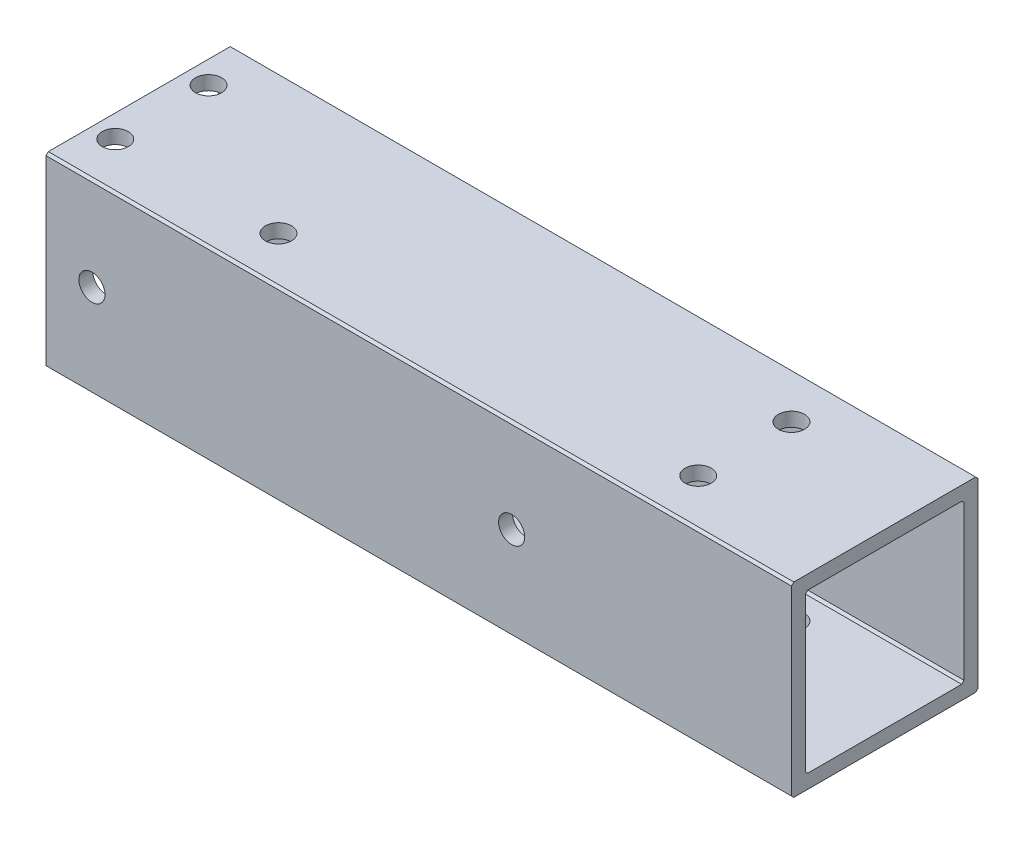
ISO-10303-21;
HEADER;
FILE_DESCRIPTION(('STEP AP214'),'2;1');
FILE_NAME('part.step','',(''),(''),'','','');
FILE_SCHEMA(('AUTOMOTIVE_DESIGN { 1 0 10303 214 1 1 1 1 }'));
ENDSEC;
DATA;
#1=APPLICATION_CONTEXT('core data for automotive mechanical design processes');
#2=APPLICATION_PROTOCOL_DEFINITION('international standard','automotive_design',2000,#1);
#3=PRODUCT_CONTEXT('',#1,'mechanical');
#4=PRODUCT('Part','Part','',(#3));
#5=PRODUCT_RELATED_PRODUCT_CATEGORY('part','',(#4));
#6=PRODUCT_DEFINITION_FORMATION('','',#4);
#7=PRODUCT_DEFINITION_CONTEXT('part definition',#1,'design');
#8=PRODUCT_DEFINITION('design','',#6,#7);
#9=PRODUCT_DEFINITION_SHAPE('','',#8);
#10=(LENGTH_UNIT() NAMED_UNIT(*) SI_UNIT(.MILLI.,.METRE.));
#11=(NAMED_UNIT(*) PLANE_ANGLE_UNIT() SI_UNIT($,.RADIAN.));
#12=(NAMED_UNIT(*) SI_UNIT($,.STERADIAN.) SOLID_ANGLE_UNIT());
#13=UNCERTAINTY_MEASURE_WITH_UNIT(LENGTH_MEASURE(1.E-05),#10,'distance_accuracy_value','');
#14=(GEOMETRIC_REPRESENTATION_CONTEXT(3) GLOBAL_UNCERTAINTY_ASSIGNED_CONTEXT((#13)) GLOBAL_UNIT_ASSIGNED_CONTEXT((#10,
#11,#12)) REPRESENTATION_CONTEXT('',''));
#15=CARTESIAN_POINT('',(0.,0.,0.));
#16=DIRECTION('',(0.,0.,1.));
#17=DIRECTION('',(1.,0.,0.));
#18=AXIS2_PLACEMENT_3D('',#15,#16,#17);
#19=CARTESIAN_POINT('',(90.15,102.,140.));
#20=DIRECTION('',(0.,0.,1.));
#21=DIRECTION('',(1.,0.,0.));
#22=AXIS2_PLACEMENT_3D('',#19,#20,#21);
#23=PLANE('',#22);
#24=CARTESIAN_POINT('',(190.,122.,140.));
#25=DIRECTION('',(0.,0.,-1.));
#26=DIRECTION('',(-1.,0.,0.));
#27=AXIS2_PLACEMENT_3D('',#24,#25,#26);
#28=CIRCLE('',#27,2.8);
#29=CARTESIAN_POINT('',(187.2,122.,140.));
#30=VERTEX_POINT('',#29);
#31=EDGE_CURVE('E581',#30,#30,#28,.T.);
#32=ORIENTED_EDGE('',*,*,#31,.T.);
#33=EDGE_LOOP('',(#32));
#34=FACE_BOUND('',#33,.T.);
#35=CARTESIAN_POINT('',(100.,122.,140.));
#36=DIRECTION('',(0.,0.,-1.));
#37=DIRECTION('',(-1.,0.,0.));
#38=AXIS2_PLACEMENT_3D('',#35,#36,#37);
#39=CIRCLE('',#38,2.79999999999998);
#40=CARTESIAN_POINT('',(97.2,122.,140.));
#41=VERTEX_POINT('',#40);
#42=EDGE_CURVE('E593',#41,#41,#39,.T.);
#43=ORIENTED_EDGE('',*,*,#42,.T.);
#44=EDGE_LOOP('',(#43));
#45=FACE_BOUND('',#44,.T.);
#46=DIRECTION('',(0.,1.,0.));
#47=VECTOR('',#46,1.);
#48=CARTESIAN_POINT('',(250.,102.,140.));
#49=LINE('',#48,#47);
#50=CARTESIAN_POINT('',(250.,102.5,140.));
#51=VERTEX_POINT('',#50);
#52=CARTESIAN_POINT('',(250.,141.5,140.));
#53=VERTEX_POINT('',#52);
#54=EDGE_CURVE('E185',#51,#53,#49,.T.);
#55=ORIENTED_EDGE('',*,*,#54,.T.);
#56=DIRECTION('',(-1.,0.,0.));
#57=VECTOR('',#56,1.);
#58=CARTESIAN_POINT('',(90.15,141.5,140.));
#59=LINE('',#58,#57);
#60=CARTESIAN_POINT('',(90.15,141.5,140.));
#61=VERTEX_POINT('',#60);
#62=EDGE_CURVE('E229',#53,#61,#59,.T.);
#63=ORIENTED_EDGE('',*,*,#62,.T.);
#64=DIRECTION('',(0.,1.,0.));
#65=VECTOR('',#64,1.);
#66=CARTESIAN_POINT('',(90.15,102.,140.));
#67=LINE('',#66,#65);
#68=CARTESIAN_POINT('',(90.15,102.5,140.));
#69=VERTEX_POINT('',#68);
#70=EDGE_CURVE('E196',#69,#61,#67,.T.);
#71=ORIENTED_EDGE('',*,*,#70,.F.);
#72=DIRECTION('',(1.,0.,0.));
#73=VECTOR('',#72,1.);
#74=CARTESIAN_POINT('',(250.,102.5,140.));
#75=LINE('',#74,#73);
#76=EDGE_CURVE('E226',#69,#51,#75,.T.);
#77=ORIENTED_EDGE('',*,*,#76,.T.);
#78=EDGE_LOOP('',(#55,#63,#71,#77));
#79=FACE_BOUND('',#78,.T.);
#80=ADVANCED_FACE('F45',(#34,#45,#79),#23,.T.);
#81=CARTESIAN_POINT('',(90.15,102.,100.));
#82=DIRECTION('',(-1.,0.,0.));
#83=DIRECTION('',(0.,0.,1.));
#84=AXIS2_PLACEMENT_3D('',#81,#82,#83);
#85=PLANE('',#84);
#86=DIRECTION('',(0.,-1.,0.));
#87=VECTOR('',#86,1.);
#88=CARTESIAN_POINT('',(90.15,139.,103.));
#89=LINE('',#88,#87);
#90=CARTESIAN_POINT('',(90.15,138.5,103.));
#91=VERTEX_POINT('',#90);
#92=CARTESIAN_POINT('',(90.15,105.5,103.));
#93=VERTEX_POINT('',#92);
#94=EDGE_CURVE('E286',#91,#93,#89,.T.);
#95=ORIENTED_EDGE('',*,*,#94,.F.);
#96=DIRECTION('',(0.,-0.707106781186548,-0.707106781186548));
#97=VECTOR('',#96,1.);
#98=CARTESIAN_POINT('',(90.15,138.5,103.));
#99=LINE('',#98,#97);
#100=CARTESIAN_POINT('',(90.15,139.,103.5));
#101=VERTEX_POINT('',#100);
#102=EDGE_CURVE('E55',#91,#101,#99,.F.);
#103=ORIENTED_EDGE('',*,*,#102,.T.);
#104=DIRECTION('',(0.,0.,-1.));
#105=VECTOR('',#104,1.);
#106=CARTESIAN_POINT('',(90.15,139.,137.));
#107=LINE('',#106,#105);
#108=CARTESIAN_POINT('',(90.15,139.,136.5));
#109=VERTEX_POINT('',#108);
#110=EDGE_CURVE('E284',#109,#101,#107,.T.);
#111=ORIENTED_EDGE('',*,*,#110,.F.);
#112=DIRECTION('',(0.,0.707106781186567,-0.707106781186528));
#113=VECTOR('',#112,1.);
#114=CARTESIAN_POINT('',(90.15,139.,136.5));
#115=LINE('',#114,#113);
#116=CARTESIAN_POINT('',(90.15,138.5,137.));
#117=VERTEX_POINT('',#116);
#118=EDGE_CURVE('E260',#109,#117,#115,.F.);
#119=ORIENTED_EDGE('',*,*,#118,.T.);
#120=DIRECTION('',(0.,1.,0.));
#121=VECTOR('',#120,1.);
#122=CARTESIAN_POINT('',(90.15,105.,137.));
#123=LINE('',#122,#121);
#124=CARTESIAN_POINT('',(90.15,105.5,137.));
#125=VERTEX_POINT('',#124);
#126=EDGE_CURVE('E297',#125,#117,#123,.T.);
#127=ORIENTED_EDGE('',*,*,#126,.F.);
#128=DIRECTION('',(0.,0.707106781186528,0.707106781186567));
#129=VECTOR('',#128,1.);
#130=CARTESIAN_POINT('',(90.15,105.5,137.));
#131=LINE('',#130,#129);
#132=CARTESIAN_POINT('',(90.15,105.,136.5));
#133=VERTEX_POINT('',#132);
#134=EDGE_CURVE('E272',#125,#133,#131,.F.);
#135=ORIENTED_EDGE('',*,*,#134,.T.);
#136=DIRECTION('',(0.,0.,1.));
#137=VECTOR('',#136,1.);
#138=CARTESIAN_POINT('',(90.15,105.,103.));
#139=LINE('',#138,#137);
#140=CARTESIAN_POINT('',(90.15,105.,103.5));
#141=VERTEX_POINT('',#140);
#142=EDGE_CURVE('E327',#141,#133,#139,.T.);
#143=ORIENTED_EDGE('',*,*,#142,.F.);
#144=DIRECTION('',(0.,-0.707106781186548,0.707106781186548));
#145=VECTOR('',#144,1.);
#146=CARTESIAN_POINT('',(90.15,105.,103.5));
#147=LINE('',#146,#145);
#148=EDGE_CURVE('E266',#141,#93,#147,.F.);
#149=ORIENTED_EDGE('',*,*,#148,.T.);
#150=EDGE_LOOP('',(#95,#103,#111,#119,#127,#135,#143,#149));
#151=FACE_BOUND('',#150,.T.);
#152=DIRECTION('',(0.,1.,0.));
#153=VECTOR('',#152,1.);
#154=CARTESIAN_POINT('',(90.15,102.,100.));
#155=LINE('',#154,#153);
#156=CARTESIAN_POINT('',(90.15,102.5,100.));
#157=VERTEX_POINT('',#156);
#158=CARTESIAN_POINT('',(90.15,141.5,100.));
#159=VERTEX_POINT('',#158);
#160=EDGE_CURVE('E184',#157,#159,#155,.T.);
#161=ORIENTED_EDGE('',*,*,#160,.F.);
#162=DIRECTION('',(0.,-0.707106781186548,0.707106781186548));
#163=VECTOR('',#162,1.);
#164=CARTESIAN_POINT('',(90.15,102.25,100.25));
#165=LINE('',#164,#163);
#166=CARTESIAN_POINT('',(90.15,102.,100.5));
#167=VERTEX_POINT('',#166);
#168=EDGE_CURVE('E188',#157,#167,#165,.T.);
#169=ORIENTED_EDGE('',*,*,#168,.T.);
#170=DIRECTION('',(0.,0.,1.));
#171=VECTOR('',#170,1.);
#172=CARTESIAN_POINT('',(90.15,102.,100.));
#173=LINE('',#172,#171);
#174=CARTESIAN_POINT('',(90.15,102.,139.5));
#175=VERTEX_POINT('',#174);
#176=EDGE_CURVE('E336',#167,#175,#173,.T.);
#177=ORIENTED_EDGE('',*,*,#176,.T.);
#178=DIRECTION('',(0.,0.707106781186538,0.707106781186557));
#179=VECTOR('',#178,1.);
#180=CARTESIAN_POINT('',(90.15,82.25,119.749999999999));
#181=LINE('',#180,#179);
#182=EDGE_CURVE('E190',#175,#69,#181,.T.);
#183=ORIENTED_EDGE('',*,*,#182,.T.);
#184=ORIENTED_EDGE('',*,*,#70,.T.);
#185=DIRECTION('',(0.,-0.707106781186567,0.707106781186528));
#186=VECTOR('',#185,1.);
#187=CARTESIAN_POINT('',(90.15,141.749999999999,139.750000000001));
#188=LINE('',#187,#186);
#189=CARTESIAN_POINT('',(90.15,142.,139.5));
#190=VERTEX_POINT('',#189);
#191=EDGE_CURVE('E194',#61,#190,#188,.F.);
#192=ORIENTED_EDGE('',*,*,#191,.T.);
#193=DIRECTION('',(0.,0.,1.));
#194=VECTOR('',#193,1.);
#195=CARTESIAN_POINT('',(90.15,142.,100.));
#196=LINE('',#195,#194);
#197=CARTESIAN_POINT('',(90.15,142.,100.5));
#198=VERTEX_POINT('',#197);
#199=EDGE_CURVE('E337',#198,#190,#196,.T.);
#200=ORIENTED_EDGE('',*,*,#199,.F.);
#201=DIRECTION('',(0.,0.707106781186548,0.707106781186548));
#202=VECTOR('',#201,1.);
#203=CARTESIAN_POINT('',(90.15,121.75,80.25));
#204=LINE('',#203,#202);
#205=EDGE_CURVE('E202',#198,#159,#204,.F.);
#206=ORIENTED_EDGE('',*,*,#205,.T.);
#207=EDGE_LOOP('',(#161,#169,#177,#183,#184,#192,#200,#206));
#208=FACE_BOUND('',#207,.T.);
#209=ADVANCED_FACE('F282',(#151,#208),#85,.T.);
#210=CARTESIAN_POINT('',(250.,102.,100.));
#211=DIRECTION('',(0.,0.,-1.));
#212=DIRECTION('',(-1.,0.,0.));
#213=AXIS2_PLACEMENT_3D('',#210,#211,#212);
#214=PLANE('',#213);
#215=CARTESIAN_POINT('',(190.,122.,100.));
#216=DIRECTION('',(0.,0.,-1.));
#217=DIRECTION('',(-1.,0.,0.));
#218=AXIS2_PLACEMENT_3D('',#215,#216,#217);
#219=CIRCLE('',#218,2.8);
#220=CARTESIAN_POINT('',(187.2,122.,100.));
#221=VERTEX_POINT('',#220);
#222=EDGE_CURVE('E476',#221,#221,#219,.T.);
#223=ORIENTED_EDGE('',*,*,#222,.F.);
#224=EDGE_LOOP('',(#223));
#225=FACE_BOUND('',#224,.T.);
#226=CARTESIAN_POINT('',(100.,122.,100.));
#227=DIRECTION('',(0.,0.,-1.));
#228=DIRECTION('',(-1.,0.,0.));
#229=AXIS2_PLACEMENT_3D('',#226,#227,#228);
#230=CIRCLE('',#229,2.79999999999998);
#231=CARTESIAN_POINT('',(97.2,122.,100.));
#232=VERTEX_POINT('',#231);
#233=EDGE_CURVE('E479',#232,#232,#230,.T.);
#234=ORIENTED_EDGE('',*,*,#233,.F.);
#235=EDGE_LOOP('',(#234));
#236=FACE_BOUND('',#235,.T.);
#237=DIRECTION('',(0.,1.,0.));
#238=VECTOR('',#237,1.);
#239=CARTESIAN_POINT('',(250.,102.,100.));
#240=LINE('',#239,#238);
#241=CARTESIAN_POINT('',(250.,102.5,100.));
#242=VERTEX_POINT('',#241);
#243=CARTESIAN_POINT('',(250.,141.5,100.));
#244=VERTEX_POINT('',#243);
#245=EDGE_CURVE('E164',#242,#244,#240,.T.);
#246=ORIENTED_EDGE('',*,*,#245,.F.);
#247=DIRECTION('',(-1.,0.,0.));
#248=VECTOR('',#247,1.);
#249=CARTESIAN_POINT('',(90.15,102.5,100.));
#250=LINE('',#249,#248);
#251=EDGE_CURVE('E179',#242,#157,#250,.T.);
#252=ORIENTED_EDGE('',*,*,#251,.T.);
#253=ORIENTED_EDGE('',*,*,#160,.T.);
#254=DIRECTION('',(1.,0.,0.));
#255=VECTOR('',#254,1.);
#256=CARTESIAN_POINT('',(250.,141.5,100.));
#257=LINE('',#256,#255);
#258=EDGE_CURVE('E182',#159,#244,#257,.T.);
#259=ORIENTED_EDGE('',*,*,#258,.T.);
#260=EDGE_LOOP('',(#246,#252,#253,#259));
#261=FACE_BOUND('',#260,.T.);
#262=ADVANCED_FACE('F177',(#225,#236,#261),#214,.T.);
#263=CARTESIAN_POINT('',(250.,102.,140.));
#264=DIRECTION('',(1.,0.,0.));
#265=DIRECTION('',(0.,0.,-1.));
#266=AXIS2_PLACEMENT_3D('',#263,#264,#265);
#267=PLANE('',#266);
#268=DIRECTION('',(0.,0.,-1.));
#269=VECTOR('',#268,1.);
#270=CARTESIAN_POINT('',(250.,139.,137.));
#271=LINE('',#270,#269);
#272=CARTESIAN_POINT('',(250.,139.,136.5));
#273=VERTEX_POINT('',#272);
#274=CARTESIAN_POINT('',(250.,139.,103.5));
#275=VERTEX_POINT('',#274);
#276=EDGE_CURVE('E304',#273,#275,#271,.T.);
#277=ORIENTED_EDGE('',*,*,#276,.T.);
#278=DIRECTION('',(0.,0.707106781186548,0.707106781186548));
#279=VECTOR('',#278,1.);
#280=CARTESIAN_POINT('',(250.,138.5,103.));
#281=LINE('',#280,#279);
#282=CARTESIAN_POINT('',(250.,138.5,103.));
#283=VERTEX_POINT('',#282);
#284=EDGE_CURVE('E11',#275,#283,#281,.F.);
#285=ORIENTED_EDGE('',*,*,#284,.T.);
#286=DIRECTION('',(0.,-1.,0.));
#287=VECTOR('',#286,1.);
#288=CARTESIAN_POINT('',(250.,139.,103.));
#289=LINE('',#288,#287);
#290=CARTESIAN_POINT('',(250.,105.5,103.));
#291=VERTEX_POINT('',#290);
#292=EDGE_CURVE('E296',#283,#291,#289,.T.);
#293=ORIENTED_EDGE('',*,*,#292,.T.);
#294=DIRECTION('',(0.,0.707106781186548,-0.707106781186548));
#295=VECTOR('',#294,1.);
#296=CARTESIAN_POINT('',(250.,105.,103.5));
#297=LINE('',#296,#295);
#298=CARTESIAN_POINT('',(250.,105.,103.5));
#299=VERTEX_POINT('',#298);
#300=EDGE_CURVE('E269',#291,#299,#297,.F.);
#301=ORIENTED_EDGE('',*,*,#300,.T.);
#302=DIRECTION('',(0.,0.,1.));
#303=VECTOR('',#302,1.);
#304=CARTESIAN_POINT('',(250.,105.,103.));
#305=LINE('',#304,#303);
#306=CARTESIAN_POINT('',(250.,105.,136.5));
#307=VERTEX_POINT('',#306);
#308=EDGE_CURVE('E309',#299,#307,#305,.T.);
#309=ORIENTED_EDGE('',*,*,#308,.T.);
#310=DIRECTION('',(0.,-0.707106781186528,-0.707106781186567));
#311=VECTOR('',#310,1.);
#312=CARTESIAN_POINT('',(250.,105.5,137.));
#313=LINE('',#312,#311);
#314=CARTESIAN_POINT('',(250.,105.5,137.));
#315=VERTEX_POINT('',#314);
#316=EDGE_CURVE('E275',#307,#315,#313,.F.);
#317=ORIENTED_EDGE('',*,*,#316,.T.);
#318=DIRECTION('',(0.,1.,0.));
#319=VECTOR('',#318,1.);
#320=CARTESIAN_POINT('',(250.,105.,137.));
#321=LINE('',#320,#319);
#322=CARTESIAN_POINT('',(250.,138.5,137.));
#323=VERTEX_POINT('',#322);
#324=EDGE_CURVE('E313',#315,#323,#321,.T.);
#325=ORIENTED_EDGE('',*,*,#324,.T.);
#326=DIRECTION('',(0.,-0.707106781186567,0.707106781186528));
#327=VECTOR('',#326,1.);
#328=CARTESIAN_POINT('',(250.,139.,136.5));
#329=LINE('',#328,#327);
#330=EDGE_CURVE('E263',#323,#273,#329,.F.);
#331=ORIENTED_EDGE('',*,*,#330,.T.);
#332=EDGE_LOOP('',(#277,#285,#293,#301,#309,#317,#325,#331));
#333=FACE_BOUND('',#332,.T.);
#334=DIRECTION('',(0.,0.,-1.));
#335=VECTOR('',#334,1.);
#336=CARTESIAN_POINT('',(250.,102.,140.));
#337=LINE('',#336,#335);
#338=CARTESIAN_POINT('',(250.,102.,139.5));
#339=VERTEX_POINT('',#338);
#340=CARTESIAN_POINT('',(250.,102.,100.5));
#341=VERTEX_POINT('',#340);
#342=EDGE_CURVE('E167',#339,#341,#337,.T.);
#343=ORIENTED_EDGE('',*,*,#342,.T.);
#344=DIRECTION('',(0.,0.707106781186548,-0.707106781186548));
#345=VECTOR('',#344,1.);
#346=CARTESIAN_POINT('',(250.,82.25,120.25));
#347=LINE('',#346,#345);
#348=EDGE_CURVE('E161',#341,#242,#347,.T.);
#349=ORIENTED_EDGE('',*,*,#348,.T.);
#350=ORIENTED_EDGE('',*,*,#245,.T.);
#351=DIRECTION('',(0.,-0.707106781186548,-0.707106781186548));
#352=VECTOR('',#351,1.);
#353=CARTESIAN_POINT('',(250.,141.75,100.25));
#354=LINE('',#353,#352);
#355=CARTESIAN_POINT('',(250.,142.,100.5));
#356=VERTEX_POINT('',#355);
#357=EDGE_CURVE('E173',#244,#356,#354,.F.);
#358=ORIENTED_EDGE('',*,*,#357,.T.);
#359=DIRECTION('',(0.,0.,-1.));
#360=VECTOR('',#359,1.);
#361=CARTESIAN_POINT('',(250.,142.,140.));
#362=LINE('',#361,#360);
#363=CARTESIAN_POINT('',(250.,142.,139.5));
#364=VERTEX_POINT('',#363);
#365=EDGE_CURVE('E324',#364,#356,#362,.T.);
#366=ORIENTED_EDGE('',*,*,#365,.F.);
#367=DIRECTION('',(0.,0.707106781186567,-0.707106781186528));
#368=VECTOR('',#367,1.);
#369=CARTESIAN_POINT('',(250.,121.749999999999,159.75));
#370=LINE('',#369,#368);
#371=EDGE_CURVE('E62',#364,#53,#370,.F.);
#372=ORIENTED_EDGE('',*,*,#371,.T.);
#373=ORIENTED_EDGE('',*,*,#54,.F.);
#374=DIRECTION('',(0.,-0.707106781186538,-0.707106781186557));
#375=VECTOR('',#374,1.);
#376=CARTESIAN_POINT('',(250.,102.25,139.75));
#377=LINE('',#376,#375);
#378=EDGE_CURVE('E70',#51,#339,#377,.T.);
#379=ORIENTED_EDGE('',*,*,#378,.T.);
#380=EDGE_LOOP('',(#343,#349,#350,#358,#366,#372,#373,#379));
#381=FACE_BOUND('',#380,.T.);
#382=ADVANCED_FACE('F163',(#333,#381),#267,.T.);
#383=CARTESIAN_POINT('',(0.,102.,0.));
#384=DIRECTION('',(0.,1.,0.));
#385=DIRECTION('',(0.,0.,1.));
#386=AXIS2_PLACEMENT_3D('',#383,#384,#385);
#387=PLANE('',#386);
#388=CARTESIAN_POINT('',(220.,102.,130.));
#389=DIRECTION('',(0.,1.,0.));
#390=DIRECTION('',(0.,0.,1.));
#391=AXIS2_PLACEMENT_3D('',#388,#389,#390);
#392=CIRCLE('',#391,2.8);
#393=CARTESIAN_POINT('',(220.,102.,132.8));
#394=VERTEX_POINT('',#393);
#395=EDGE_CURVE('E497',#394,#394,#392,.T.);
#396=ORIENTED_EDGE('',*,*,#395,.T.);
#397=EDGE_LOOP('',(#396));
#398=FACE_BOUND('',#397,.T.);
#399=CARTESIAN_POINT('',(220.,102.,110.));
#400=DIRECTION('',(0.,1.,0.));
#401=DIRECTION('',(0.,0.,1.));
#402=AXIS2_PLACEMENT_3D('',#399,#400,#401);
#403=CIRCLE('',#402,2.8);
#404=CARTESIAN_POINT('',(220.,102.,112.8));
#405=VERTEX_POINT('',#404);
#406=EDGE_CURVE('E505',#405,#405,#403,.T.);
#407=ORIENTED_EDGE('',*,*,#406,.T.);
#408=EDGE_LOOP('',(#407));
#409=FACE_BOUND('',#408,.T.);
#410=CARTESIAN_POINT('',(130.,102.,130.));
#411=DIRECTION('',(0.,1.,0.));
#412=DIRECTION('',(0.,0.,1.));
#413=AXIS2_PLACEMENT_3D('',#410,#411,#412);
#414=CIRCLE('',#413,2.8);
#415=CARTESIAN_POINT('',(130.,102.,132.8));
#416=VERTEX_POINT('',#415);
#417=EDGE_CURVE('E513',#416,#416,#414,.T.);
#418=ORIENTED_EDGE('',*,*,#417,.T.);
#419=EDGE_LOOP('',(#418));
#420=FACE_BOUND('',#419,.T.);
#421=CARTESIAN_POINT('',(95.,102.,130.));
#422=DIRECTION('',(0.,1.,0.));
#423=DIRECTION('',(0.,0.,1.));
#424=AXIS2_PLACEMENT_3D('',#421,#422,#423);
#425=CIRCLE('',#424,2.79999999999998);
#426=CARTESIAN_POINT('',(95.,102.,132.8));
#427=VERTEX_POINT('',#426);
#428=EDGE_CURVE('E521',#427,#427,#425,.T.);
#429=ORIENTED_EDGE('',*,*,#428,.T.);
#430=EDGE_LOOP('',(#429));
#431=FACE_BOUND('',#430,.T.);
#432=CARTESIAN_POINT('',(95.,102.,110.));
#433=DIRECTION('',(0.,1.,0.));
#434=DIRECTION('',(0.,0.,1.));
#435=AXIS2_PLACEMENT_3D('',#432,#433,#434);
#436=CIRCLE('',#435,2.79999999999998);
#437=CARTESIAN_POINT('',(95.,102.,112.8));
#438=VERTEX_POINT('',#437);
#439=EDGE_CURVE('E316',#438,#438,#436,.T.);
#440=ORIENTED_EDGE('',*,*,#439,.T.);
#441=EDGE_LOOP('',(#440));
#442=FACE_BOUND('',#441,.T.);
#443=ORIENTED_EDGE('',*,*,#176,.F.);
#444=DIRECTION('',(1.,0.,0.));
#445=VECTOR('',#444,1.);
#446=CARTESIAN_POINT('',(250.,102.,100.5));
#447=LINE('',#446,#445);
#448=EDGE_CURVE('E210',#167,#341,#447,.T.);
#449=ORIENTED_EDGE('',*,*,#448,.T.);
#450=ORIENTED_EDGE('',*,*,#342,.F.);
#451=DIRECTION('',(-1.,0.,0.));
#452=VECTOR('',#451,1.);
#453=CARTESIAN_POINT('',(90.15,102.,139.5));
#454=LINE('',#453,#452);
#455=EDGE_CURVE('E207',#339,#175,#454,.T.);
#456=ORIENTED_EDGE('',*,*,#455,.T.);
#457=EDGE_LOOP('',(#443,#449,#450,#456));
#458=FACE_BOUND('',#457,.T.);
#459=ADVANCED_FACE('F368',(#398,#409,#420,#431,#442,#458),#387,.F.);
#460=CARTESIAN_POINT('',(0.,142.,0.));
#461=DIRECTION('',(0.,1.,0.));
#462=DIRECTION('',(0.,0.,1.));
#463=AXIS2_PLACEMENT_3D('',#460,#461,#462);
#464=PLANE('',#463);
#465=CARTESIAN_POINT('',(220.,142.,130.));
#466=DIRECTION('',(0.,1.,0.));
#467=DIRECTION('',(0.,0.,1.));
#468=AXIS2_PLACEMENT_3D('',#465,#466,#467);
#469=CIRCLE('',#468,2.8);
#470=CARTESIAN_POINT('',(220.,142.,132.8));
#471=VERTEX_POINT('',#470);
#472=EDGE_CURVE('E894',#471,#471,#469,.T.);
#473=ORIENTED_EDGE('',*,*,#472,.F.);
#474=EDGE_LOOP('',(#473));
#475=FACE_BOUND('',#474,.T.);
#476=CARTESIAN_POINT('',(220.,142.,110.));
#477=DIRECTION('',(0.,1.,0.));
#478=DIRECTION('',(0.,0.,1.));
#479=AXIS2_PLACEMENT_3D('',#476,#477,#478);
#480=CIRCLE('',#479,2.8);
#481=CARTESIAN_POINT('',(220.,142.,112.8));
#482=VERTEX_POINT('',#481);
#483=EDGE_CURVE('E896',#482,#482,#480,.T.);
#484=ORIENTED_EDGE('',*,*,#483,.F.);
#485=EDGE_LOOP('',(#484));
#486=FACE_BOUND('',#485,.T.);
#487=CARTESIAN_POINT('',(130.,142.,130.));
#488=DIRECTION('',(0.,1.,0.));
#489=DIRECTION('',(0.,0.,1.));
#490=AXIS2_PLACEMENT_3D('',#487,#488,#489);
#491=CIRCLE('',#490,2.8);
#492=CARTESIAN_POINT('',(130.,142.,132.8));
#493=VERTEX_POINT('',#492);
#494=EDGE_CURVE('E906',#493,#493,#491,.T.);
#495=ORIENTED_EDGE('',*,*,#494,.F.);
#496=EDGE_LOOP('',(#495));
#497=FACE_BOUND('',#496,.T.);
#498=CARTESIAN_POINT('',(95.,142.,130.));
#499=DIRECTION('',(0.,1.,0.));
#500=DIRECTION('',(0.,0.,1.));
#501=AXIS2_PLACEMENT_3D('',#498,#499,#500);
#502=CIRCLE('',#501,2.79999999999998);
#503=CARTESIAN_POINT('',(95.,142.,132.8));
#504=VERTEX_POINT('',#503);
#505=EDGE_CURVE('E912',#504,#504,#502,.T.);
#506=ORIENTED_EDGE('',*,*,#505,.F.);
#507=EDGE_LOOP('',(#506));
#508=FACE_BOUND('',#507,.T.);
#509=CARTESIAN_POINT('',(95.,142.,110.));
#510=DIRECTION('',(0.,1.,0.));
#511=DIRECTION('',(0.,0.,1.));
#512=AXIS2_PLACEMENT_3D('',#509,#510,#511);
#513=CIRCLE('',#512,2.79999999999998);
#514=CARTESIAN_POINT('',(95.,142.,112.8));
#515=VERTEX_POINT('',#514);
#516=EDGE_CURVE('E576',#515,#515,#513,.T.);
#517=ORIENTED_EDGE('',*,*,#516,.F.);
#518=EDGE_LOOP('',(#517));
#519=FACE_BOUND('',#518,.T.);
#520=ORIENTED_EDGE('',*,*,#365,.T.);
#521=DIRECTION('',(-1.,0.,0.));
#522=VECTOR('',#521,1.);
#523=CARTESIAN_POINT('',(0.,142.,100.5));
#524=LINE('',#523,#522);
#525=EDGE_CURVE('E222',#356,#198,#524,.T.);
#526=ORIENTED_EDGE('',*,*,#525,.T.);
#527=ORIENTED_EDGE('',*,*,#199,.T.);
#528=DIRECTION('',(1.,0.,0.));
#529=VECTOR('',#528,1.);
#530=CARTESIAN_POINT('',(0.,142.,139.5));
#531=LINE('',#530,#529);
#532=EDGE_CURVE('E172',#190,#364,#531,.T.);
#533=ORIENTED_EDGE('',*,*,#532,.T.);
#534=EDGE_LOOP('',(#520,#526,#527,#533));
#535=FACE_BOUND('',#534,.T.);
#536=ADVANCED_FACE('F361',(#475,#486,#497,#508,#519,#535),#464,.T.);
#537=CARTESIAN_POINT('',(250.,139.,103.));
#538=DIRECTION('',(0.,0.,-1.));
#539=DIRECTION('',(-1.,0.,0.));
#540=AXIS2_PLACEMENT_3D('',#537,#538,#539);
#541=PLANE('',#540);
#542=CARTESIAN_POINT('',(190.,122.,103.));
#543=DIRECTION('',(0.,0.,-1.));
#544=DIRECTION('',(-1.,0.,0.));
#545=AXIS2_PLACEMENT_3D('',#542,#543,#544);
#546=CIRCLE('',#545,2.8);
#547=CARTESIAN_POINT('',(187.2,122.,103.));
#548=VERTEX_POINT('',#547);
#549=EDGE_CURVE('E483',#548,#548,#546,.T.);
#550=ORIENTED_EDGE('',*,*,#549,.T.);
#551=EDGE_LOOP('',(#550));
#552=FACE_BOUND('',#551,.T.);
#553=CARTESIAN_POINT('',(100.,122.,103.));
#554=DIRECTION('',(0.,0.,-1.));
#555=DIRECTION('',(-1.,0.,0.));
#556=AXIS2_PLACEMENT_3D('',#553,#554,#555);
#557=CIRCLE('',#556,2.79999999999999);
#558=CARTESIAN_POINT('',(97.2,122.,103.));
#559=VERTEX_POINT('',#558);
#560=EDGE_CURVE('E482',#559,#559,#557,.T.);
#561=ORIENTED_EDGE('',*,*,#560,.T.);
#562=EDGE_LOOP('',(#561));
#563=FACE_BOUND('',#562,.T.);
#564=ORIENTED_EDGE('',*,*,#94,.T.);
#565=DIRECTION('',(1.,0.,0.));
#566=VECTOR('',#565,1.);
#567=CARTESIAN_POINT('',(250.,105.5,103.));
#568=LINE('',#567,#566);
#569=EDGE_CURVE('E257',#93,#291,#568,.T.);
#570=ORIENTED_EDGE('',*,*,#569,.T.);
#571=ORIENTED_EDGE('',*,*,#292,.F.);
#572=DIRECTION('',(-1.,0.,0.));
#573=VECTOR('',#572,1.);
#574=CARTESIAN_POINT('',(90.15,138.5,103.));
#575=LINE('',#574,#573);
#576=EDGE_CURVE('E253',#283,#91,#575,.T.);
#577=ORIENTED_EDGE('',*,*,#576,.T.);
#578=EDGE_LOOP('',(#564,#570,#571,#577));
#579=FACE_BOUND('',#578,.T.);
#580=ADVANCED_FACE('F306',(#552,#563,#579),#541,.F.);
#581=CARTESIAN_POINT('',(250.,139.,137.));
#582=DIRECTION('',(0.,1.,0.));
#583=DIRECTION('',(0.,0.,1.));
#584=AXIS2_PLACEMENT_3D('',#581,#582,#583);
#585=PLANE('',#584);
#586=CARTESIAN_POINT('',(220.,139.,130.));
#587=DIRECTION('',(0.,1.,0.));
#588=DIRECTION('',(0.,0.,1.));
#589=AXIS2_PLACEMENT_3D('',#586,#587,#588);
#590=CIRCLE('',#589,2.79999999999998);
#591=CARTESIAN_POINT('',(220.,139.,132.8));
#592=VERTEX_POINT('',#591);
#593=EDGE_CURVE('E557',#592,#592,#590,.T.);
#594=ORIENTED_EDGE('',*,*,#593,.T.);
#595=EDGE_LOOP('',(#594));
#596=FACE_BOUND('',#595,.T.);
#597=CARTESIAN_POINT('',(220.,139.,110.));
#598=DIRECTION('',(0.,1.,0.));
#599=DIRECTION('',(0.,0.,1.));
#600=AXIS2_PLACEMENT_3D('',#597,#598,#599);
#601=CIRCLE('',#600,2.79999999999998);
#602=CARTESIAN_POINT('',(220.,139.,112.8));
#603=VERTEX_POINT('',#602);
#604=EDGE_CURVE('E561',#603,#603,#601,.T.);
#605=ORIENTED_EDGE('',*,*,#604,.T.);
#606=EDGE_LOOP('',(#605));
#607=FACE_BOUND('',#606,.T.);
#608=CARTESIAN_POINT('',(130.,139.,130.));
#609=DIRECTION('',(0.,1.,0.));
#610=DIRECTION('',(0.,0.,1.));
#611=AXIS2_PLACEMENT_3D('',#608,#609,#610);
#612=CIRCLE('',#611,2.79999999999998);
#613=CARTESIAN_POINT('',(130.,139.,132.8));
#614=VERTEX_POINT('',#613);
#615=EDGE_CURVE('E565',#614,#614,#612,.T.);
#616=ORIENTED_EDGE('',*,*,#615,.T.);
#617=EDGE_LOOP('',(#616));
#618=FACE_BOUND('',#617,.T.);
#619=CARTESIAN_POINT('',(95.,139.,130.));
#620=DIRECTION('',(0.,1.,0.));
#621=DIRECTION('',(0.,0.,1.));
#622=AXIS2_PLACEMENT_3D('',#619,#620,#621);
#623=CIRCLE('',#622,2.79999999999998);
#624=CARTESIAN_POINT('',(95.,139.,132.8));
#625=VERTEX_POINT('',#624);
#626=EDGE_CURVE('E569',#625,#625,#623,.T.);
#627=ORIENTED_EDGE('',*,*,#626,.T.);
#628=EDGE_LOOP('',(#627));
#629=FACE_BOUND('',#628,.T.);
#630=CARTESIAN_POINT('',(95.,139.,110.));
#631=DIRECTION('',(0.,1.,0.));
#632=DIRECTION('',(0.,0.,1.));
#633=AXIS2_PLACEMENT_3D('',#630,#631,#632);
#634=CIRCLE('',#633,2.79999999999998);
#635=CARTESIAN_POINT('',(95.,139.,112.8));
#636=VERTEX_POINT('',#635);
#637=EDGE_CURVE('E572',#636,#636,#634,.T.);
#638=ORIENTED_EDGE('',*,*,#637,.T.);
#639=EDGE_LOOP('',(#638));
#640=FACE_BOUND('',#639,.T.);
#641=ORIENTED_EDGE('',*,*,#276,.F.);
#642=DIRECTION('',(-1.,0.,0.));
#643=VECTOR('',#642,1.);
#644=CARTESIAN_POINT('',(90.15,139.,136.5));
#645=LINE('',#644,#643);
#646=EDGE_CURVE('E235',#273,#109,#645,.T.);
#647=ORIENTED_EDGE('',*,*,#646,.T.);
#648=ORIENTED_EDGE('',*,*,#110,.T.);
#649=DIRECTION('',(1.,0.,0.));
#650=VECTOR('',#649,1.);
#651=CARTESIAN_POINT('',(250.,139.,103.5));
#652=LINE('',#651,#650);
#653=EDGE_CURVE('E232',#101,#275,#652,.T.);
#654=ORIENTED_EDGE('',*,*,#653,.T.);
#655=EDGE_LOOP('',(#641,#647,#648,#654));
#656=FACE_BOUND('',#655,.T.);
#657=ADVANCED_FACE('F292',(#596,#607,#618,#629,#640,#656),#585,.F.);
#658=CARTESIAN_POINT('',(250.,105.,137.));
#659=DIRECTION('',(0.,0.,1.));
#660=DIRECTION('',(1.,0.,0.));
#661=AXIS2_PLACEMENT_3D('',#658,#659,#660);
#662=PLANE('',#661);
#663=CARTESIAN_POINT('',(190.,122.,137.));
#664=DIRECTION('',(0.,0.,-1.));
#665=DIRECTION('',(-1.,0.,0.));
#666=AXIS2_PLACEMENT_3D('',#663,#664,#665);
#667=CIRCLE('',#666,2.8);
#668=CARTESIAN_POINT('',(187.2,122.,137.));
#669=VERTEX_POINT('',#668);
#670=EDGE_CURVE('E575',#669,#669,#667,.T.);
#671=ORIENTED_EDGE('',*,*,#670,.F.);
#672=EDGE_LOOP('',(#671));
#673=FACE_BOUND('',#672,.T.);
#674=CARTESIAN_POINT('',(100.,122.,137.));
#675=DIRECTION('',(0.,0.,-1.));
#676=DIRECTION('',(-1.,0.,0.));
#677=AXIS2_PLACEMENT_3D('',#674,#675,#676);
#678=CIRCLE('',#677,2.79999999999998);
#679=CARTESIAN_POINT('',(97.2,122.,137.));
#680=VERTEX_POINT('',#679);
#681=EDGE_CURVE('E589',#680,#680,#678,.T.);
#682=ORIENTED_EDGE('',*,*,#681,.F.);
#683=EDGE_LOOP('',(#682));
#684=FACE_BOUND('',#683,.T.);
#685=ORIENTED_EDGE('',*,*,#126,.T.);
#686=DIRECTION('',(1.,0.,0.));
#687=VECTOR('',#686,1.);
#688=CARTESIAN_POINT('',(250.,138.5,137.));
#689=LINE('',#688,#687);
#690=EDGE_CURVE('E243',#117,#323,#689,.T.);
#691=ORIENTED_EDGE('',*,*,#690,.T.);
#692=ORIENTED_EDGE('',*,*,#324,.F.);
#693=DIRECTION('',(-1.,0.,0.));
#694=VECTOR('',#693,1.);
#695=CARTESIAN_POINT('',(90.15,105.5,137.));
#696=LINE('',#695,#694);
#697=EDGE_CURVE('E239',#315,#125,#696,.T.);
#698=ORIENTED_EDGE('',*,*,#697,.T.);
#699=EDGE_LOOP('',(#685,#691,#692,#698));
#700=FACE_BOUND('',#699,.T.);
#701=ADVANCED_FACE('F436',(#673,#684,#700),#662,.F.);
#702=CARTESIAN_POINT('',(250.,105.,103.));
#703=DIRECTION('',(0.,-1.,0.));
#704=DIRECTION('',(0.,0.,-1.));
#705=AXIS2_PLACEMENT_3D('',#702,#703,#704);
#706=PLANE('',#705);
#707=CARTESIAN_POINT('',(220.,105.,130.));
#708=DIRECTION('',(0.,1.,0.));
#709=DIRECTION('',(0.,0.,1.));
#710=AXIS2_PLACEMENT_3D('',#707,#708,#709);
#711=CIRCLE('',#710,2.8);
#712=CARTESIAN_POINT('',(220.,105.,132.8));
#713=VERTEX_POINT('',#712);
#714=EDGE_CURVE('E488',#713,#713,#711,.T.);
#715=ORIENTED_EDGE('',*,*,#714,.F.);
#716=EDGE_LOOP('',(#715));
#717=FACE_BOUND('',#716,.T.);
#718=CARTESIAN_POINT('',(220.,105.,110.));
#719=DIRECTION('',(0.,1.,0.));
#720=DIRECTION('',(0.,0.,1.));
#721=AXIS2_PLACEMENT_3D('',#718,#719,#720);
#722=CIRCLE('',#721,2.8);
#723=CARTESIAN_POINT('',(220.,105.,112.8));
#724=VERTEX_POINT('',#723);
#725=EDGE_CURVE('E501',#724,#724,#722,.T.);
#726=ORIENTED_EDGE('',*,*,#725,.F.);
#727=EDGE_LOOP('',(#726));
#728=FACE_BOUND('',#727,.T.);
#729=CARTESIAN_POINT('',(130.,105.,130.));
#730=DIRECTION('',(0.,1.,0.));
#731=DIRECTION('',(0.,0.,1.));
#732=AXIS2_PLACEMENT_3D('',#729,#730,#731);
#733=CIRCLE('',#732,2.8);
#734=CARTESIAN_POINT('',(130.,105.,132.8));
#735=VERTEX_POINT('',#734);
#736=EDGE_CURVE('E509',#735,#735,#733,.T.);
#737=ORIENTED_EDGE('',*,*,#736,.F.);
#738=EDGE_LOOP('',(#737));
#739=FACE_BOUND('',#738,.T.);
#740=CARTESIAN_POINT('',(95.,105.,130.));
#741=DIRECTION('',(0.,1.,0.));
#742=DIRECTION('',(0.,0.,1.));
#743=AXIS2_PLACEMENT_3D('',#740,#741,#742);
#744=CIRCLE('',#743,2.79999999999998);
#745=CARTESIAN_POINT('',(95.,105.,132.8));
#746=VERTEX_POINT('',#745);
#747=EDGE_CURVE('E517',#746,#746,#744,.T.);
#748=ORIENTED_EDGE('',*,*,#747,.F.);
#749=EDGE_LOOP('',(#748));
#750=FACE_BOUND('',#749,.T.);
#751=CARTESIAN_POINT('',(95.,105.,110.));
#752=DIRECTION('',(0.,1.,0.));
#753=DIRECTION('',(0.,0.,1.));
#754=AXIS2_PLACEMENT_3D('',#751,#752,#753);
#755=CIRCLE('',#754,2.79999999999998);
#756=CARTESIAN_POINT('',(95.,105.,112.8));
#757=VERTEX_POINT('',#756);
#758=EDGE_CURVE('E524',#757,#757,#755,.T.);
#759=ORIENTED_EDGE('',*,*,#758,.F.);
#760=EDGE_LOOP('',(#759));
#761=FACE_BOUND('',#760,.T.);
#762=ORIENTED_EDGE('',*,*,#308,.F.);
#763=DIRECTION('',(-1.,0.,0.));
#764=VECTOR('',#763,1.);
#765=CARTESIAN_POINT('',(90.15,105.,103.5));
#766=LINE('',#765,#764);
#767=EDGE_CURVE('E249',#299,#141,#766,.T.);
#768=ORIENTED_EDGE('',*,*,#767,.T.);
#769=ORIENTED_EDGE('',*,*,#142,.T.);
#770=DIRECTION('',(1.,0.,0.));
#771=VECTOR('',#770,1.);
#772=CARTESIAN_POINT('',(250.,105.,136.5));
#773=LINE('',#772,#771);
#774=EDGE_CURVE('E246',#133,#307,#773,.T.);
#775=ORIENTED_EDGE('',*,*,#774,.T.);
#776=EDGE_LOOP('',(#762,#768,#769,#775));
#777=FACE_BOUND('',#776,.T.);
#778=ADVANCED_FACE('F441',(#717,#728,#739,#750,#761,#777),#706,.F.);
#779=CARTESIAN_POINT('',(95.,105.,110.));
#780=DIRECTION('',(0.,1.,0.));
#781=DIRECTION('',(0.,0.,1.));
#782=AXIS2_PLACEMENT_3D('',#779,#780,#781);
#783=CYLINDRICAL_SURFACE('',#782,2.79999999999998);
#784=ORIENTED_EDGE('',*,*,#439,.F.);
#785=EDGE_LOOP('',(#784));
#786=FACE_BOUND('',#785,.T.);
#787=ORIENTED_EDGE('',*,*,#758,.T.);
#788=EDGE_LOOP('',(#787));
#789=FACE_BOUND('',#788,.T.);
#790=ADVANCED_FACE('F444',(#786,#789),#783,.F.);
#791=CARTESIAN_POINT('',(95.,105.,130.));
#792=DIRECTION('',(0.,1.,0.));
#793=DIRECTION('',(0.,0.,1.));
#794=AXIS2_PLACEMENT_3D('',#791,#792,#793);
#795=CYLINDRICAL_SURFACE('',#794,2.79999999999998);
#796=ORIENTED_EDGE('',*,*,#428,.F.);
#797=EDGE_LOOP('',(#796));
#798=FACE_BOUND('',#797,.T.);
#799=ORIENTED_EDGE('',*,*,#747,.T.);
#800=EDGE_LOOP('',(#799));
#801=FACE_BOUND('',#800,.T.);
#802=ADVANCED_FACE('F451',(#798,#801),#795,.F.);
#803=CARTESIAN_POINT('',(130.,105.,130.));
#804=DIRECTION('',(0.,1.,0.));
#805=DIRECTION('',(0.,0.,1.));
#806=AXIS2_PLACEMENT_3D('',#803,#804,#805);
#807=CYLINDRICAL_SURFACE('',#806,2.8);
#808=ORIENTED_EDGE('',*,*,#417,.F.);
#809=EDGE_LOOP('',(#808));
#810=FACE_BOUND('',#809,.T.);
#811=ORIENTED_EDGE('',*,*,#736,.T.);
#812=EDGE_LOOP('',(#811));
#813=FACE_BOUND('',#812,.T.);
#814=ADVANCED_FACE('F539',(#810,#813),#807,.F.);
#815=CARTESIAN_POINT('',(220.,105.,110.));
#816=DIRECTION('',(0.,1.,0.));
#817=DIRECTION('',(0.,0.,1.));
#818=AXIS2_PLACEMENT_3D('',#815,#816,#817);
#819=CYLINDRICAL_SURFACE('',#818,2.8);
#820=ORIENTED_EDGE('',*,*,#406,.F.);
#821=EDGE_LOOP('',(#820));
#822=FACE_BOUND('',#821,.T.);
#823=ORIENTED_EDGE('',*,*,#725,.T.);
#824=EDGE_LOOP('',(#823));
#825=FACE_BOUND('',#824,.T.);
#826=ADVANCED_FACE('F546',(#822,#825),#819,.F.);
#827=CARTESIAN_POINT('',(220.,105.,130.));
#828=DIRECTION('',(0.,1.,0.));
#829=DIRECTION('',(0.,0.,1.));
#830=AXIS2_PLACEMENT_3D('',#827,#828,#829);
#831=CYLINDRICAL_SURFACE('',#830,2.8);
#832=ORIENTED_EDGE('',*,*,#395,.F.);
#833=EDGE_LOOP('',(#832));
#834=FACE_BOUND('',#833,.T.);
#835=ORIENTED_EDGE('',*,*,#714,.T.);
#836=EDGE_LOOP('',(#835));
#837=FACE_BOUND('',#836,.T.);
#838=ADVANCED_FACE('F611',(#834,#837),#831,.F.);
#839=CARTESIAN_POINT('',(100.,122.,100.));
#840=DIRECTION('',(0.,0.,-1.));
#841=DIRECTION('',(-1.,0.,0.));
#842=AXIS2_PLACEMENT_3D('',#839,#840,#841);
#843=CYLINDRICAL_SURFACE('',#842,2.79999999999999);
#844=ORIENTED_EDGE('',*,*,#560,.F.);
#845=EDGE_LOOP('',(#844));
#846=FACE_BOUND('',#845,.T.);
#847=ORIENTED_EDGE('',*,*,#233,.T.);
#848=EDGE_LOOP('',(#847));
#849=FACE_BOUND('',#848,.T.);
#850=ADVANCED_FACE('F601',(#846,#849),#843,.F.);
#851=CARTESIAN_POINT('',(190.,122.,100.));
#852=DIRECTION('',(0.,0.,-1.));
#853=DIRECTION('',(-1.,0.,0.));
#854=AXIS2_PLACEMENT_3D('',#851,#852,#853);
#855=CYLINDRICAL_SURFACE('',#854,2.8);
#856=ORIENTED_EDGE('',*,*,#549,.F.);
#857=EDGE_LOOP('',(#856));
#858=FACE_BOUND('',#857,.T.);
#859=ORIENTED_EDGE('',*,*,#222,.T.);
#860=EDGE_LOOP('',(#859));
#861=FACE_BOUND('',#860,.T.);
#862=ADVANCED_FACE('F598',(#858,#861),#855,.F.);
#863=CARTESIAN_POINT('',(100.,122.,137.));
#864=DIRECTION('',(0.,0.,-1.));
#865=DIRECTION('',(-1.,0.,0.));
#866=AXIS2_PLACEMENT_3D('',#863,#864,#865);
#867=CYLINDRICAL_SURFACE('',#866,2.79999999999998);
#868=ORIENTED_EDGE('',*,*,#42,.F.);
#869=EDGE_LOOP('',(#868));
#870=FACE_BOUND('',#869,.T.);
#871=ORIENTED_EDGE('',*,*,#681,.T.);
#872=EDGE_LOOP('',(#871));
#873=FACE_BOUND('',#872,.T.);
#874=ADVANCED_FACE('F600',(#870,#873),#867,.F.);
#875=CARTESIAN_POINT('',(190.,122.,137.));
#876=DIRECTION('',(0.,0.,-1.));
#877=DIRECTION('',(-1.,0.,0.));
#878=AXIS2_PLACEMENT_3D('',#875,#876,#877);
#879=CYLINDRICAL_SURFACE('',#878,2.8);
#880=ORIENTED_EDGE('',*,*,#31,.F.);
#881=EDGE_LOOP('',(#880));
#882=FACE_BOUND('',#881,.T.);
#883=ORIENTED_EDGE('',*,*,#670,.T.);
#884=EDGE_LOOP('',(#883));
#885=FACE_BOUND('',#884,.T.);
#886=ADVANCED_FACE('F608',(#882,#885),#879,.F.);
#887=CARTESIAN_POINT('',(95.,142.,110.));
#888=DIRECTION('',(0.,1.,0.));
#889=DIRECTION('',(0.,0.,1.));
#890=AXIS2_PLACEMENT_3D('',#887,#888,#889);
#891=CYLINDRICAL_SURFACE('',#890,2.79999999999998);
#892=ORIENTED_EDGE('',*,*,#516,.T.);
#893=EDGE_LOOP('',(#892));
#894=FACE_BOUND('',#893,.T.);
#895=ORIENTED_EDGE('',*,*,#637,.F.);
#896=EDGE_LOOP('',(#895));
#897=FACE_BOUND('',#896,.T.);
#898=ADVANCED_FACE('F664',(#894,#897),#891,.F.);
#899=CARTESIAN_POINT('',(95.,142.,130.));
#900=DIRECTION('',(0.,1.,0.));
#901=DIRECTION('',(0.,0.,1.));
#902=AXIS2_PLACEMENT_3D('',#899,#900,#901);
#903=CYLINDRICAL_SURFACE('',#902,2.79999999999998);
#904=ORIENTED_EDGE('',*,*,#505,.T.);
#905=EDGE_LOOP('',(#904));
#906=FACE_BOUND('',#905,.T.);
#907=ORIENTED_EDGE('',*,*,#626,.F.);
#908=EDGE_LOOP('',(#907));
#909=FACE_BOUND('',#908,.T.);
#910=ADVANCED_FACE('F674',(#906,#909),#903,.F.);
#911=CARTESIAN_POINT('',(130.,142.,130.));
#912=DIRECTION('',(0.,1.,0.));
#913=DIRECTION('',(0.,0.,1.));
#914=AXIS2_PLACEMENT_3D('',#911,#912,#913);
#915=CYLINDRICAL_SURFACE('',#914,2.79999999999998);
#916=ORIENTED_EDGE('',*,*,#494,.T.);
#917=EDGE_LOOP('',(#916));
#918=FACE_BOUND('',#917,.T.);
#919=ORIENTED_EDGE('',*,*,#615,.F.);
#920=EDGE_LOOP('',(#919));
#921=FACE_BOUND('',#920,.T.);
#922=ADVANCED_FACE('F685',(#918,#921),#915,.F.);
#923=CARTESIAN_POINT('',(220.,142.,110.));
#924=DIRECTION('',(0.,1.,0.));
#925=DIRECTION('',(0.,0.,1.));
#926=AXIS2_PLACEMENT_3D('',#923,#924,#925);
#927=CYLINDRICAL_SURFACE('',#926,2.79999999999998);
#928=ORIENTED_EDGE('',*,*,#483,.T.);
#929=EDGE_LOOP('',(#928));
#930=FACE_BOUND('',#929,.T.);
#931=ORIENTED_EDGE('',*,*,#604,.F.);
#932=EDGE_LOOP('',(#931));
#933=FACE_BOUND('',#932,.T.);
#934=ADVANCED_FACE('F696',(#930,#933),#927,.F.);
#935=CARTESIAN_POINT('',(220.,142.,130.));
#936=DIRECTION('',(0.,1.,0.));
#937=DIRECTION('',(0.,0.,1.));
#938=AXIS2_PLACEMENT_3D('',#935,#936,#937);
#939=CYLINDRICAL_SURFACE('',#938,2.79999999999998);
#940=ORIENTED_EDGE('',*,*,#472,.T.);
#941=EDGE_LOOP('',(#940));
#942=FACE_BOUND('',#941,.T.);
#943=ORIENTED_EDGE('',*,*,#593,.F.);
#944=EDGE_LOOP('',(#943));
#945=FACE_BOUND('',#944,.T.);
#946=ADVANCED_FACE('F402',(#942,#945),#939,.F.);
#947=CARTESIAN_POINT('',(250.,102.5,100.));
#948=DIRECTION('',(0.,-0.707106781186548,-0.707106781186548));
#949=DIRECTION('',(1.,0.,0.));
#950=AXIS2_PLACEMENT_3D('',#947,#948,#949);
#951=PLANE('',#950);
#952=ORIENTED_EDGE('',*,*,#348,.F.);
#953=ORIENTED_EDGE('',*,*,#448,.F.);
#954=ORIENTED_EDGE('',*,*,#168,.F.);
#955=ORIENTED_EDGE('',*,*,#251,.F.);
#956=EDGE_LOOP('',(#952,#953,#954,#955));
#957=FACE_BOUND('',#956,.T.);
#958=ADVANCED_FACE('F187',(#957),#951,.T.);
#959=CARTESIAN_POINT('',(0.,142.,100.5));
#960=DIRECTION('',(0.,-0.707106781186547,0.707106781186547));
#961=DIRECTION('',(-1.,0.,0.));
#962=AXIS2_PLACEMENT_3D('',#959,#960,#961);
#963=PLANE('',#962);
#964=ORIENTED_EDGE('',*,*,#357,.F.);
#965=ORIENTED_EDGE('',*,*,#258,.F.);
#966=ORIENTED_EDGE('',*,*,#205,.F.);
#967=ORIENTED_EDGE('',*,*,#525,.F.);
#968=EDGE_LOOP('',(#964,#965,#966,#967));
#969=FACE_BOUND('',#968,.T.);
#970=ADVANCED_FACE('F364',(#969),#963,.F.);
#971=CARTESIAN_POINT('',(0.,142.,139.5));
#972=DIRECTION('',(0.,-0.707106781186528,-0.707106781186567));
#973=DIRECTION('',(1.,0.,0.));
#974=AXIS2_PLACEMENT_3D('',#971,#972,#973);
#975=PLANE('',#974);
#976=ORIENTED_EDGE('',*,*,#191,.F.);
#977=ORIENTED_EDGE('',*,*,#62,.F.);
#978=ORIENTED_EDGE('',*,*,#371,.F.);
#979=ORIENTED_EDGE('',*,*,#532,.F.);
#980=EDGE_LOOP('',(#976,#977,#978,#979));
#981=FACE_BOUND('',#980,.T.);
#982=ADVANCED_FACE('F357',(#981),#975,.F.);
#983=CARTESIAN_POINT('',(250.,139.,136.5));
#984=DIRECTION('',(0.,-0.707106781186528,-0.707106781186567));
#985=DIRECTION('',(1.,0.,0.));
#986=AXIS2_PLACEMENT_3D('',#983,#984,#985);
#987=PLANE('',#986);
#988=ORIENTED_EDGE('',*,*,#330,.F.);
#989=ORIENTED_EDGE('',*,*,#690,.F.);
#990=ORIENTED_EDGE('',*,*,#118,.F.);
#991=ORIENTED_EDGE('',*,*,#646,.F.);
#992=EDGE_LOOP('',(#988,#989,#990,#991));
#993=FACE_BOUND('',#992,.T.);
#994=ADVANCED_FACE('F372',(#993),#987,.T.);
#995=CARTESIAN_POINT('',(90.15,102.5,140.));
#996=DIRECTION('',(0.,-0.707106781186557,0.707106781186538));
#997=DIRECTION('',(-1.,0.,0.));
#998=AXIS2_PLACEMENT_3D('',#995,#996,#997);
#999=PLANE('',#998);
#1000=ORIENTED_EDGE('',*,*,#182,.F.);
#1001=ORIENTED_EDGE('',*,*,#455,.F.);
#1002=ORIENTED_EDGE('',*,*,#378,.F.);
#1003=ORIENTED_EDGE('',*,*,#76,.F.);
#1004=EDGE_LOOP('',(#1000,#1001,#1002,#1003));
#1005=FACE_BOUND('',#1004,.T.);
#1006=ADVANCED_FACE('F369',(#1005),#999,.T.);
#1007=CARTESIAN_POINT('',(250.,105.,103.5));
#1008=DIRECTION('',(0.,0.707106781186547,0.707106781186547));
#1009=DIRECTION('',(1.,0.,0.));
#1010=AXIS2_PLACEMENT_3D('',#1007,#1008,#1009);
#1011=PLANE('',#1010);
#1012=ORIENTED_EDGE('',*,*,#300,.F.);
#1013=ORIENTED_EDGE('',*,*,#569,.F.);
#1014=ORIENTED_EDGE('',*,*,#148,.F.);
#1015=ORIENTED_EDGE('',*,*,#767,.F.);
#1016=EDGE_LOOP('',(#1012,#1013,#1014,#1015));
#1017=FACE_BOUND('',#1016,.T.);
#1018=ADVANCED_FACE('F371',(#1017),#1011,.T.);
#1019=CARTESIAN_POINT('',(250.,105.5,137.));
#1020=DIRECTION('',(0.,0.707106781186567,-0.707106781186528));
#1021=DIRECTION('',(1.,0.,0.));
#1022=AXIS2_PLACEMENT_3D('',#1019,#1020,#1021);
#1023=PLANE('',#1022);
#1024=ORIENTED_EDGE('',*,*,#316,.F.);
#1025=ORIENTED_EDGE('',*,*,#774,.F.);
#1026=ORIENTED_EDGE('',*,*,#134,.F.);
#1027=ORIENTED_EDGE('',*,*,#697,.F.);
#1028=EDGE_LOOP('',(#1024,#1025,#1026,#1027));
#1029=FACE_BOUND('',#1028,.T.);
#1030=ADVANCED_FACE('F378',(#1029),#1023,.T.);
#1031=CARTESIAN_POINT('',(250.,138.5,103.));
#1032=DIRECTION('',(0.,-0.707106781186547,0.707106781186547));
#1033=DIRECTION('',(1.,0.,0.));
#1034=AXIS2_PLACEMENT_3D('',#1031,#1032,#1033);
#1035=PLANE('',#1034);
#1036=ORIENTED_EDGE('',*,*,#284,.F.);
#1037=ORIENTED_EDGE('',*,*,#653,.F.);
#1038=ORIENTED_EDGE('',*,*,#102,.F.);
#1039=ORIENTED_EDGE('',*,*,#576,.F.);
#1040=EDGE_LOOP('',(#1036,#1037,#1038,#1039));
#1041=FACE_BOUND('',#1040,.T.);
#1042=ADVANCED_FACE('F48',(#1041),#1035,.T.);
#1043=CLOSED_SHELL('',(#80,#209,#262,#382,#459,#536,#580,#657,#701,#778,#790,#802,#814,#826,
#838,#850,#862,#874,#886,#898,#910,#922,#934,#946,#958,#970,#982,#994,#1006,#1018,#1030,#1042));
#1044=MANIFOLD_SOLID_BREP('B2',#1043);
#1045=ADVANCED_BREP_SHAPE_REPRESENTATION('',(#18,#1044),#14);
#1046=SHAPE_DEFINITION_REPRESENTATION(#9,#1045);
ENDSEC;
END-ISO-10303-21;
